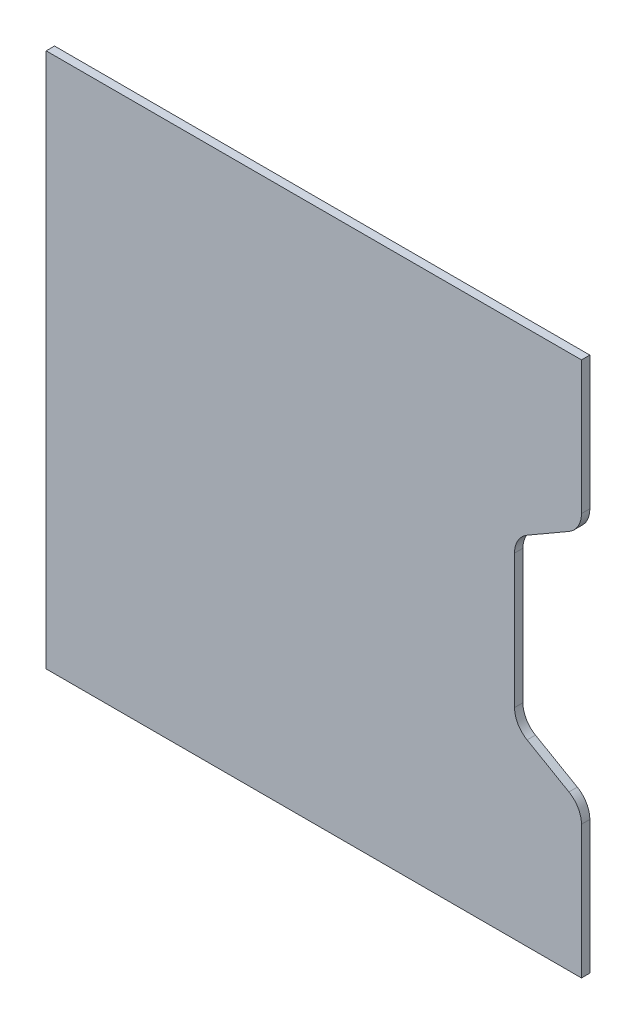
ISO-10303-21;
HEADER;
FILE_DESCRIPTION(('STEP AP214'),'2;1');
FILE_NAME('part.step','',(''),(''),'','','');
FILE_SCHEMA(('AUTOMOTIVE_DESIGN { 1 0 10303 214 1 1 1 1 }'));
ENDSEC;
DATA;
#1=APPLICATION_CONTEXT('core data for automotive mechanical design processes');
#2=APPLICATION_PROTOCOL_DEFINITION('international standard','automotive_design',2000,#1);
#3=PRODUCT_CONTEXT('',#1,'mechanical');
#4=PRODUCT('Part','Part','',(#3));
#5=PRODUCT_RELATED_PRODUCT_CATEGORY('part','',(#4));
#6=PRODUCT_DEFINITION_FORMATION('','',#4);
#7=PRODUCT_DEFINITION_CONTEXT('part definition',#1,'design');
#8=PRODUCT_DEFINITION('design','',#6,#7);
#9=PRODUCT_DEFINITION_SHAPE('','',#8);
#10=(LENGTH_UNIT() NAMED_UNIT(*) SI_UNIT(.MILLI.,.METRE.));
#11=(NAMED_UNIT(*) PLANE_ANGLE_UNIT() SI_UNIT($,.RADIAN.));
#12=(NAMED_UNIT(*) SI_UNIT($,.STERADIAN.) SOLID_ANGLE_UNIT());
#13=UNCERTAINTY_MEASURE_WITH_UNIT(LENGTH_MEASURE(1.E-05),#10,'distance_accuracy_value','');
#14=(GEOMETRIC_REPRESENTATION_CONTEXT(3) GLOBAL_UNCERTAINTY_ASSIGNED_CONTEXT((#13)) GLOBAL_UNIT_ASSIGNED_CONTEXT((#10,
#11,#12)) REPRESENTATION_CONTEXT('',''));
#15=CARTESIAN_POINT('',(0.,0.,0.));
#16=DIRECTION('',(0.,0.,1.));
#17=DIRECTION('',(1.,0.,0.));
#18=AXIS2_PLACEMENT_3D('',#15,#16,#17);
#19=CARTESIAN_POINT('',(101.6,-101.6,-3.175));
#20=DIRECTION('',(1.,0.,0.));
#21=DIRECTION('',(0.,0.,-1.));
#22=AXIS2_PLACEMENT_3D('',#19,#20,#21);
#23=PLANE('',#22);
#24=DIRECTION('',(0.,1.,0.));
#25=VECTOR('',#24,1.);
#26=CARTESIAN_POINT('',(101.6,-101.6,0.));
#27=LINE('',#26,#25);
#28=CARTESIAN_POINT('',(101.6,51.063219465479,0.));
#29=VERTEX_POINT('',#28);
#30=CARTESIAN_POINT('',(101.6,101.6,0.));
#31=VERTEX_POINT('',#30);
#32=EDGE_CURVE('E184',#29,#31,#27,.T.);
#33=ORIENTED_EDGE('',*,*,#32,.F.);
#34=DIRECTION('',(0.,0.,1.));
#35=VECTOR('',#34,1.);
#36=CARTESIAN_POINT('',(101.6,51.063219465479,-3.175));
#37=LINE('',#36,#35);
#38=CARTESIAN_POINT('',(101.6,51.063219465479,-3.175));
#39=VERTEX_POINT('',#38);
#40=EDGE_CURVE('E191',#39,#29,#37,.T.);
#41=ORIENTED_EDGE('',*,*,#40,.F.);
#42=DIRECTION('',(0.,1.,0.));
#43=VECTOR('',#42,1.);
#44=CARTESIAN_POINT('',(101.6,-101.6,-3.175));
#45=LINE('',#44,#43);
#46=CARTESIAN_POINT('',(101.6,101.6,-3.175));
#47=VERTEX_POINT('',#46);
#48=EDGE_CURVE('E84',#39,#47,#45,.T.);
#49=ORIENTED_EDGE('',*,*,#48,.T.);
#50=DIRECTION('',(0.,0.,1.));
#51=VECTOR('',#50,1.);
#52=CARTESIAN_POINT('',(101.6,101.6,-3.175));
#53=LINE('',#52,#51);
#54=EDGE_CURVE('E37',#47,#31,#53,.T.);
#55=ORIENTED_EDGE('',*,*,#54,.T.);
#56=EDGE_LOOP('',(#33,#41,#49,#55));
#57=FACE_BOUND('',#56,.T.);
#58=ADVANCED_FACE('F33',(#57),#23,.T.);
#59=DIRECTION('',(0.,0.,1.));
#60=VECTOR('',#59,1.);
#61=CARTESIAN_POINT('',(101.6,-51.063219465479,-3.175));
#62=LINE('',#61,#60);
#63=CARTESIAN_POINT('',(101.6,-51.063219465479,-3.175));
#64=VERTEX_POINT('',#63);
#65=CARTESIAN_POINT('',(101.6,-51.063219465479,0.));
#66=VERTEX_POINT('',#65);
#67=EDGE_CURVE('E193',#64,#66,#62,.T.);
#68=ORIENTED_EDGE('',*,*,#67,.T.);
#69=CARTESIAN_POINT('',(101.6,-101.6,0.));
#70=VERTEX_POINT('',#69);
#71=EDGE_CURVE('E207',#70,#66,#27,.T.);
#72=ORIENTED_EDGE('',*,*,#71,.F.);
#73=DIRECTION('',(0.,0.,1.));
#74=VECTOR('',#73,1.);
#75=CARTESIAN_POINT('',(101.6,-101.6,-3.175));
#76=LINE('',#75,#74);
#77=CARTESIAN_POINT('',(101.6,-101.6,-3.175));
#78=VERTEX_POINT('',#77);
#79=EDGE_CURVE('E11',#78,#70,#76,.T.);
#80=ORIENTED_EDGE('',*,*,#79,.F.);
#81=EDGE_CURVE('E197',#78,#64,#45,.T.);
#82=ORIENTED_EDGE('',*,*,#81,.T.);
#83=EDGE_LOOP('',(#68,#72,#80,#82));
#84=FACE_BOUND('',#83,.T.);
#85=ADVANCED_FACE('F35',(#84),#23,.T.);
#86=CARTESIAN_POINT('',(-101.6,-101.6,-3.175));
#87=DIRECTION('',(0.,-1.,0.));
#88=DIRECTION('',(0.,0.,-1.));
#89=AXIS2_PLACEMENT_3D('',#86,#87,#88);
#90=PLANE('',#89);
#91=DIRECTION('',(1.,0.,0.));
#92=VECTOR('',#91,1.);
#93=CARTESIAN_POINT('',(-101.6,-101.6,0.));
#94=LINE('',#93,#92);
#95=CARTESIAN_POINT('',(-101.6,-101.6,0.));
#96=VERTEX_POINT('',#95);
#97=EDGE_CURVE('E216',#96,#70,#94,.T.);
#98=ORIENTED_EDGE('',*,*,#97,.F.);
#99=DIRECTION('',(0.,0.,1.));
#100=VECTOR('',#99,1.);
#101=CARTESIAN_POINT('',(-101.6,-101.6,-3.175));
#102=LINE('',#101,#100);
#103=CARTESIAN_POINT('',(-101.6,-101.6,-3.175));
#104=VERTEX_POINT('',#103);
#105=EDGE_CURVE('E42',#104,#96,#102,.T.);
#106=ORIENTED_EDGE('',*,*,#105,.F.);
#107=DIRECTION('',(1.,0.,0.));
#108=VECTOR('',#107,1.);
#109=CARTESIAN_POINT('',(-101.6,-101.6,-3.175));
#110=LINE('',#109,#108);
#111=EDGE_CURVE('E205',#104,#78,#110,.T.);
#112=ORIENTED_EDGE('',*,*,#111,.T.);
#113=ORIENTED_EDGE('',*,*,#79,.T.);
#114=EDGE_LOOP('',(#98,#106,#112,#113));
#115=FACE_BOUND('',#114,.T.);
#116=ADVANCED_FACE('F238',(#115),#90,.T.);
#117=CARTESIAN_POINT('',(-101.6,-101.6,-3.175));
#118=DIRECTION('',(-1.,0.,0.));
#119=DIRECTION('',(0.,0.,1.));
#120=AXIS2_PLACEMENT_3D('',#117,#118,#119);
#121=PLANE('',#120);
#122=DIRECTION('',(0.,-1.,0.));
#123=VECTOR('',#122,1.);
#124=CARTESIAN_POINT('',(-101.6,-101.6,0.));
#125=LINE('',#124,#123);
#126=CARTESIAN_POINT('',(-101.6,101.6,0.));
#127=VERTEX_POINT('',#126);
#128=EDGE_CURVE('E213',#127,#96,#125,.T.);
#129=ORIENTED_EDGE('',*,*,#128,.F.);
#130=DIRECTION('',(0.,0.,1.));
#131=VECTOR('',#130,1.);
#132=CARTESIAN_POINT('',(-101.6,101.6,-3.175));
#133=LINE('',#132,#131);
#134=CARTESIAN_POINT('',(-101.6,101.6,-3.175));
#135=VERTEX_POINT('',#134);
#136=EDGE_CURVE('E219',#135,#127,#133,.T.);
#137=ORIENTED_EDGE('',*,*,#136,.F.);
#138=DIRECTION('',(0.,-1.,0.));
#139=VECTOR('',#138,1.);
#140=CARTESIAN_POINT('',(-101.6,-101.6,-3.175));
#141=LINE('',#140,#139);
#142=EDGE_CURVE('E202',#135,#104,#141,.T.);
#143=ORIENTED_EDGE('',*,*,#142,.T.);
#144=ORIENTED_EDGE('',*,*,#105,.T.);
#145=EDGE_LOOP('',(#129,#137,#143,#144));
#146=FACE_BOUND('',#145,.T.);
#147=ADVANCED_FACE('F237',(#146),#121,.T.);
#148=CARTESIAN_POINT('',(-101.6,101.6,-3.175));
#149=DIRECTION('',(0.,1.,0.));
#150=DIRECTION('',(0.,0.,1.));
#151=AXIS2_PLACEMENT_3D('',#148,#149,#150);
#152=PLANE('',#151);
#153=DIRECTION('',(-1.,0.,0.));
#154=VECTOR('',#153,1.);
#155=CARTESIAN_POINT('',(-101.6,101.6,0.));
#156=LINE('',#155,#154);
#157=EDGE_CURVE('E210',#31,#127,#156,.T.);
#158=ORIENTED_EDGE('',*,*,#157,.F.);
#159=ORIENTED_EDGE('',*,*,#54,.F.);
#160=DIRECTION('',(-1.,0.,0.));
#161=VECTOR('',#160,1.);
#162=CARTESIAN_POINT('',(-101.6,101.6,-3.175));
#163=LINE('',#162,#161);
#164=EDGE_CURVE('E199',#47,#135,#163,.T.);
#165=ORIENTED_EDGE('',*,*,#164,.T.);
#166=ORIENTED_EDGE('',*,*,#136,.T.);
#167=EDGE_LOOP('',(#158,#159,#165,#166));
#168=FACE_BOUND('',#167,.T.);
#169=ADVANCED_FACE('F225',(#168),#152,.T.);
#170=CARTESIAN_POINT('',(0.,0.,-3.175));
#171=DIRECTION('',(0.,0.,-1.));
#172=DIRECTION('',(-1.,0.,0.));
#173=AXIS2_PLACEMENT_3D('',#170,#171,#172);
#174=PLANE('',#173);
#175=CARTESIAN_POINT('',(92.075,51.063219465479,-3.175));
#176=DIRECTION('',(0.,0.,-1.));
#177=DIRECTION('',(-1.,0.,0.));
#178=AXIS2_PLACEMENT_3D('',#175,#176,#177);
#179=CIRCLE('',#178,9.52500000000014);
#180=CARTESIAN_POINT('',(96.8375,42.8143274944319,-3.175));
#181=VERTEX_POINT('',#180);
#182=EDGE_CURVE('E161',#39,#181,#179,.T.);
#183=ORIENTED_EDGE('',*,*,#182,.T.);
#184=DIRECTION('',(-0.866025403784441,-0.499999999999996,0.));
#185=VECTOR('',#184,1.);
#186=CARTESIAN_POINT('',(96.8375,42.8143274944319,-3.175));
#187=LINE('',#186,#185);
#188=CARTESIAN_POINT('',(80.9625000000001,33.6488919710467,-3.175));
#189=VERTEX_POINT('',#188);
#190=EDGE_CURVE('E163',#181,#189,#187,.T.);
#191=ORIENTED_EDGE('',*,*,#190,.T.);
#192=CARTESIAN_POINT('',(85.725,25.4,-3.175));
#193=DIRECTION('',(0.,0.,1.));
#194=DIRECTION('',(1.,0.,0.));
#195=AXIS2_PLACEMENT_3D('',#192,#193,#194);
#196=CIRCLE('',#195,9.52499999999991);
#197=CARTESIAN_POINT('',(76.2000000000001,25.3999999999999,-3.175));
#198=VERTEX_POINT('',#197);
#199=EDGE_CURVE('E166',#189,#198,#196,.T.);
#200=ORIENTED_EDGE('',*,*,#199,.T.);
#201=DIRECTION('',(0.,-1.,0.));
#202=VECTOR('',#201,1.);
#203=CARTESIAN_POINT('',(76.2000000000001,25.3999999999999,-3.175));
#204=LINE('',#203,#202);
#205=CARTESIAN_POINT('',(76.2000000000001,-25.4000000000001,-3.175));
#206=VERTEX_POINT('',#205);
#207=EDGE_CURVE('E140',#198,#206,#204,.T.);
#208=ORIENTED_EDGE('',*,*,#207,.T.);
#209=CARTESIAN_POINT('',(85.725,-25.4,-3.175));
#210=DIRECTION('',(0.,0.,1.));
#211=DIRECTION('',(1.,0.,0.));
#212=AXIS2_PLACEMENT_3D('',#209,#210,#211);
#213=CIRCLE('',#212,9.52499999999997);
#214=CARTESIAN_POINT('',(80.9625,-33.6488919710468,-3.175));
#215=VERTEX_POINT('',#214);
#216=EDGE_CURVE('E134',#206,#215,#213,.T.);
#217=ORIENTED_EDGE('',*,*,#216,.T.);
#218=DIRECTION('',(0.866025403784436,-0.500000000000004,0.));
#219=VECTOR('',#218,1.);
#220=CARTESIAN_POINT('',(80.9625,-33.6488919710468,-3.175));
#221=LINE('',#220,#219);
#222=CARTESIAN_POINT('',(96.8375,-42.8143274944322,-3.175));
#223=VERTEX_POINT('',#222);
#224=EDGE_CURVE('E143',#215,#223,#221,.T.);
#225=ORIENTED_EDGE('',*,*,#224,.T.);
#226=CARTESIAN_POINT('',(92.075,-51.063219465479,-3.175));
#227=DIRECTION('',(0.,0.,-1.));
#228=DIRECTION('',(-1.,0.,0.));
#229=AXIS2_PLACEMENT_3D('',#226,#227,#228);
#230=CIRCLE('',#229,9.525);
#231=EDGE_CURVE('E148',#223,#64,#230,.T.);
#232=ORIENTED_EDGE('',*,*,#231,.T.);
#233=ORIENTED_EDGE('',*,*,#81,.F.);
#234=ORIENTED_EDGE('',*,*,#111,.F.);
#235=ORIENTED_EDGE('',*,*,#142,.F.);
#236=ORIENTED_EDGE('',*,*,#164,.F.);
#237=ORIENTED_EDGE('',*,*,#48,.F.);
#238=EDGE_LOOP('',(#183,#191,#200,#208,#217,#225,#232,#233,#234,#235,#236,#237));
#239=FACE_BOUND('',#238,.T.);
#240=ADVANCED_FACE('F151',(#239),#174,.T.);
#241=CARTESIAN_POINT('',(0.,0.,0.));
#242=DIRECTION('',(0.,0.,-1.));
#243=DIRECTION('',(-1.,0.,0.));
#244=AXIS2_PLACEMENT_3D('',#241,#242,#243);
#245=PLANE('',#244);
#246=DIRECTION('',(-0.866025403784441,-0.499999999999996,0.));
#247=VECTOR('',#246,1.);
#248=CARTESIAN_POINT('',(96.8375,42.8143274944319,0.));
#249=LINE('',#248,#247);
#250=CARTESIAN_POINT('',(96.8375,42.8143274944319,0.));
#251=VERTEX_POINT('',#250);
#252=CARTESIAN_POINT('',(80.9625000000001,33.6488919710467,0.));
#253=VERTEX_POINT('',#252);
#254=EDGE_CURVE('E177',#251,#253,#249,.T.);
#255=ORIENTED_EDGE('',*,*,#254,.F.);
#256=CARTESIAN_POINT('',(92.075,51.063219465479,0.));
#257=DIRECTION('',(0.,0.,-1.));
#258=DIRECTION('',(-1.,0.,0.));
#259=AXIS2_PLACEMENT_3D('',#256,#257,#258);
#260=CIRCLE('',#259,9.52500000000014);
#261=EDGE_CURVE('E174',#29,#251,#260,.T.);
#262=ORIENTED_EDGE('',*,*,#261,.F.);
#263=ORIENTED_EDGE('',*,*,#32,.T.);
#264=ORIENTED_EDGE('',*,*,#157,.T.);
#265=ORIENTED_EDGE('',*,*,#128,.T.);
#266=ORIENTED_EDGE('',*,*,#97,.T.);
#267=ORIENTED_EDGE('',*,*,#71,.T.);
#268=CARTESIAN_POINT('',(92.075,-51.063219465479,0.));
#269=DIRECTION('',(0.,0.,-1.));
#270=DIRECTION('',(-1.,0.,0.));
#271=AXIS2_PLACEMENT_3D('',#268,#269,#270);
#272=CIRCLE('',#271,9.525);
#273=CARTESIAN_POINT('',(96.8375,-42.8143274944322,0.));
#274=VERTEX_POINT('',#273);
#275=EDGE_CURVE('E172',#274,#66,#272,.T.);
#276=ORIENTED_EDGE('',*,*,#275,.F.);
#277=DIRECTION('',(0.866025403784436,-0.500000000000004,0.));
#278=VECTOR('',#277,1.);
#279=CARTESIAN_POINT('',(80.9625,-33.6488919710468,0.));
#280=LINE('',#279,#278);
#281=CARTESIAN_POINT('',(80.9625,-33.6488919710468,0.));
#282=VERTEX_POINT('',#281);
#283=EDGE_CURVE('E170',#282,#274,#280,.T.);
#284=ORIENTED_EDGE('',*,*,#283,.F.);
#285=CARTESIAN_POINT('',(85.725,-25.4,0.));
#286=DIRECTION('',(0.,0.,1.));
#287=DIRECTION('',(1.,0.,0.));
#288=AXIS2_PLACEMENT_3D('',#285,#286,#287);
#289=CIRCLE('',#288,9.52499999999997);
#290=CARTESIAN_POINT('',(76.2000000000001,-25.4000000000001,0.));
#291=VERTEX_POINT('',#290);
#292=EDGE_CURVE('E50',#291,#282,#289,.T.);
#293=ORIENTED_EDGE('',*,*,#292,.F.);
#294=DIRECTION('',(0.,-1.,0.));
#295=VECTOR('',#294,1.);
#296=CARTESIAN_POINT('',(76.2000000000001,25.3999999999999,0.));
#297=LINE('',#296,#295);
#298=CARTESIAN_POINT('',(76.2000000000001,25.3999999999999,0.));
#299=VERTEX_POINT('',#298);
#300=EDGE_CURVE('E154',#299,#291,#297,.T.);
#301=ORIENTED_EDGE('',*,*,#300,.F.);
#302=CARTESIAN_POINT('',(85.725,25.4,0.));
#303=DIRECTION('',(0.,0.,1.));
#304=DIRECTION('',(1.,0.,0.));
#305=AXIS2_PLACEMENT_3D('',#302,#303,#304);
#306=CIRCLE('',#305,9.52499999999991);
#307=EDGE_CURVE('E157',#253,#299,#306,.T.);
#308=ORIENTED_EDGE('',*,*,#307,.F.);
#309=EDGE_LOOP('',(#255,#262,#263,#264,#265,#266,#267,#276,#284,#293,#301,#308));
#310=FACE_BOUND('',#309,.T.);
#311=ADVANCED_FACE('F228',(#310),#245,.F.);
#312=CARTESIAN_POINT('',(85.725,-25.4,-3.175));
#313=DIRECTION('',(0.,0.,1.));
#314=DIRECTION('',(1.,0.,0.));
#315=AXIS2_PLACEMENT_3D('',#312,#313,#314);
#316=CYLINDRICAL_SURFACE('',#315,9.52499999999997);
#317=ORIENTED_EDGE('',*,*,#292,.T.);
#318=DIRECTION('',(0.,0.,1.));
#319=VECTOR('',#318,1.);
#320=CARTESIAN_POINT('',(80.9625,-33.6488919710468,-3.175));
#321=LINE('',#320,#319);
#322=EDGE_CURVE('E130',#215,#282,#321,.T.);
#323=ORIENTED_EDGE('',*,*,#322,.F.);
#324=ORIENTED_EDGE('',*,*,#216,.F.);
#325=DIRECTION('',(0.,0.,1.));
#326=VECTOR('',#325,1.);
#327=CARTESIAN_POINT('',(76.2000000000001,-25.4000000000001,-3.175));
#328=LINE('',#327,#326);
#329=EDGE_CURVE('E182',#206,#291,#328,.T.);
#330=ORIENTED_EDGE('',*,*,#329,.T.);
#331=EDGE_LOOP('',(#317,#323,#324,#330));
#332=FACE_BOUND('',#331,.T.);
#333=ADVANCED_FACE('F132',(#332),#316,.F.);
#334=CARTESIAN_POINT('',(76.2000000000001,25.3999999999999,-3.175));
#335=DIRECTION('',(-1.,0.,0.));
#336=DIRECTION('',(0.,0.,1.));
#337=AXIS2_PLACEMENT_3D('',#334,#335,#336);
#338=PLANE('',#337);
#339=ORIENTED_EDGE('',*,*,#300,.T.);
#340=ORIENTED_EDGE('',*,*,#329,.F.);
#341=ORIENTED_EDGE('',*,*,#207,.F.);
#342=DIRECTION('',(0.,0.,1.));
#343=VECTOR('',#342,1.);
#344=CARTESIAN_POINT('',(76.2000000000001,25.3999999999999,-3.175));
#345=LINE('',#344,#343);
#346=EDGE_CURVE('E185',#198,#299,#345,.T.);
#347=ORIENTED_EDGE('',*,*,#346,.T.);
#348=EDGE_LOOP('',(#339,#340,#341,#347));
#349=FACE_BOUND('',#348,.T.);
#350=ADVANCED_FACE('F244',(#349),#338,.F.);
#351=CARTESIAN_POINT('',(85.725,25.4,-3.175));
#352=DIRECTION('',(0.,0.,1.));
#353=DIRECTION('',(1.,0.,0.));
#354=AXIS2_PLACEMENT_3D('',#351,#352,#353);
#355=CYLINDRICAL_SURFACE('',#354,9.52499999999991);
#356=ORIENTED_EDGE('',*,*,#307,.T.);
#357=ORIENTED_EDGE('',*,*,#346,.F.);
#358=ORIENTED_EDGE('',*,*,#199,.F.);
#359=DIRECTION('',(0.,0.,1.));
#360=VECTOR('',#359,1.);
#361=CARTESIAN_POINT('',(80.9625000000001,33.6488919710467,-3.175));
#362=LINE('',#361,#360);
#363=EDGE_CURVE('E187',#189,#253,#362,.T.);
#364=ORIENTED_EDGE('',*,*,#363,.T.);
#365=EDGE_LOOP('',(#356,#357,#358,#364));
#366=FACE_BOUND('',#365,.T.);
#367=ADVANCED_FACE('F247',(#366),#355,.F.);
#368=CARTESIAN_POINT('',(96.8375,42.8143274944319,-3.175));
#369=DIRECTION('',(-0.499999999999996,0.866025403784441,0.));
#370=DIRECTION('',(-0.866025403784441,-0.499999999999996,0.));
#371=AXIS2_PLACEMENT_3D('',#368,#369,#370);
#372=PLANE('',#371);
#373=ORIENTED_EDGE('',*,*,#254,.T.);
#374=ORIENTED_EDGE('',*,*,#363,.F.);
#375=ORIENTED_EDGE('',*,*,#190,.F.);
#376=DIRECTION('',(0.,0.,1.));
#377=VECTOR('',#376,1.);
#378=CARTESIAN_POINT('',(96.8375,42.8143274944319,-3.175));
#379=LINE('',#378,#377);
#380=EDGE_CURVE('E189',#181,#251,#379,.T.);
#381=ORIENTED_EDGE('',*,*,#380,.T.);
#382=EDGE_LOOP('',(#373,#374,#375,#381));
#383=FACE_BOUND('',#382,.T.);
#384=ADVANCED_FACE('F249',(#383),#372,.F.);
#385=CARTESIAN_POINT('',(92.075,51.063219465479,-3.175));
#386=DIRECTION('',(0.,0.,1.));
#387=DIRECTION('',(1.,0.,0.));
#388=AXIS2_PLACEMENT_3D('',#385,#386,#387);
#389=CYLINDRICAL_SURFACE('',#388,9.52500000000014);
#390=ORIENTED_EDGE('',*,*,#261,.T.);
#391=ORIENTED_EDGE('',*,*,#380,.F.);
#392=ORIENTED_EDGE('',*,*,#182,.F.);
#393=ORIENTED_EDGE('',*,*,#40,.T.);
#394=EDGE_LOOP('',(#390,#391,#392,#393));
#395=FACE_BOUND('',#394,.T.);
#396=ADVANCED_FACE('F232',(#395),#389,.T.);
#397=CARTESIAN_POINT('',(92.075,-51.063219465479,-3.175));
#398=DIRECTION('',(0.,0.,1.));
#399=DIRECTION('',(1.,0.,0.));
#400=AXIS2_PLACEMENT_3D('',#397,#398,#399);
#401=CYLINDRICAL_SURFACE('',#400,9.525);
#402=ORIENTED_EDGE('',*,*,#275,.T.);
#403=ORIENTED_EDGE('',*,*,#67,.F.);
#404=ORIENTED_EDGE('',*,*,#231,.F.);
#405=DIRECTION('',(0.,0.,1.));
#406=VECTOR('',#405,1.);
#407=CARTESIAN_POINT('',(96.8375,-42.8143274944322,-3.175));
#408=LINE('',#407,#406);
#409=EDGE_CURVE('E139',#223,#274,#408,.T.);
#410=ORIENTED_EDGE('',*,*,#409,.T.);
#411=EDGE_LOOP('',(#402,#403,#404,#410));
#412=FACE_BOUND('',#411,.T.);
#413=ADVANCED_FACE('F241',(#412),#401,.T.);
#414=CARTESIAN_POINT('',(80.9625,-33.6488919710468,-3.175));
#415=DIRECTION('',(-0.500000000000004,-0.866025403784436,0.));
#416=DIRECTION('',(0.866025403784436,-0.500000000000004,0.));
#417=AXIS2_PLACEMENT_3D('',#414,#415,#416);
#418=PLANE('',#417);
#419=ORIENTED_EDGE('',*,*,#283,.T.);
#420=ORIENTED_EDGE('',*,*,#409,.F.);
#421=ORIENTED_EDGE('',*,*,#224,.F.);
#422=ORIENTED_EDGE('',*,*,#322,.T.);
#423=EDGE_LOOP('',(#419,#420,#421,#422));
#424=FACE_BOUND('',#423,.T.);
#425=ADVANCED_FACE('F144',(#424),#418,.F.);
#426=CLOSED_SHELL('',(#58,#85,#116,#147,#169,#240,#311,#333,#350,#367,#384,#396,#413,#425));
#427=MANIFOLD_SOLID_BREP('B2',#426);
#428=ADVANCED_BREP_SHAPE_REPRESENTATION('',(#18,#427),#14);
#429=SHAPE_DEFINITION_REPRESENTATION(#9,#428);
ENDSEC;
END-ISO-10303-21;
